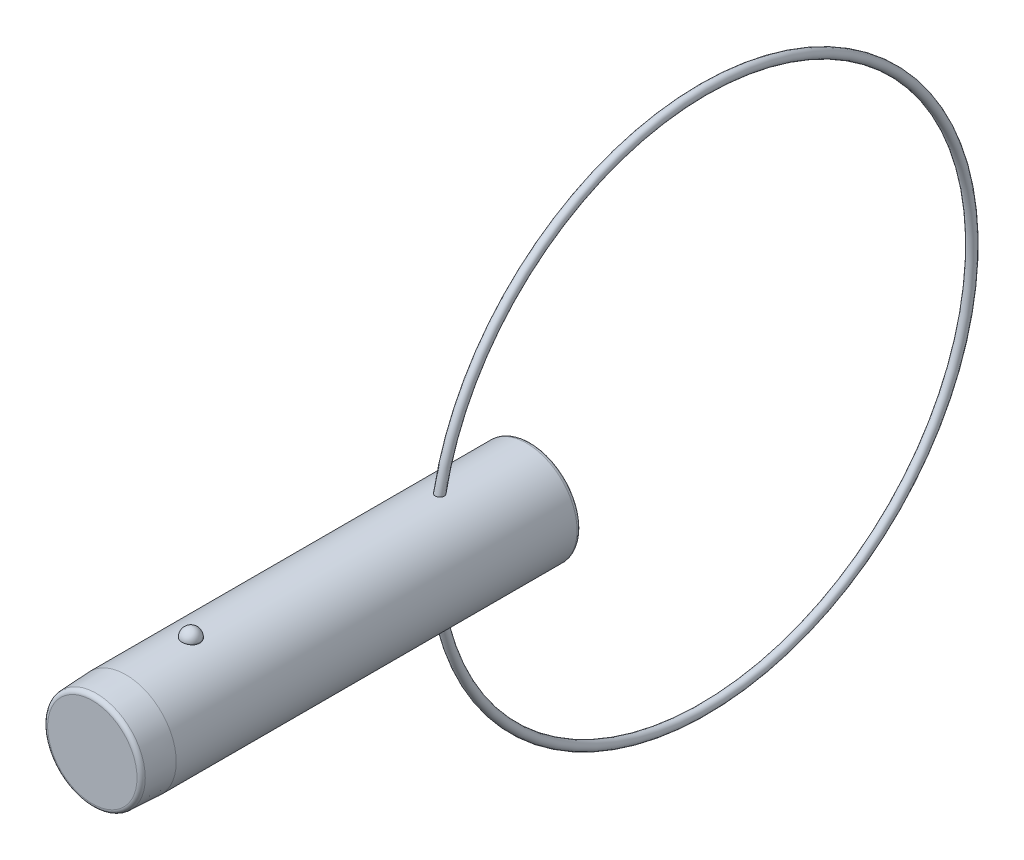
ISO-10303-21;
HEADER;
FILE_DESCRIPTION(('STEP AP214'),'2;1');
FILE_NAME('part.step','',(''),(''),'','','');
FILE_SCHEMA(('AUTOMOTIVE_DESIGN { 1 0 10303 214 1 1 1 1 }'));
ENDSEC;
DATA;
#1=APPLICATION_CONTEXT('core data for automotive mechanical design processes');
#2=APPLICATION_PROTOCOL_DEFINITION('international standard','automotive_design',2000,#1);
#3=PRODUCT_CONTEXT('',#1,'mechanical');
#4=PRODUCT('Part','Part','',(#3));
#5=PRODUCT_RELATED_PRODUCT_CATEGORY('part','',(#4));
#6=PRODUCT_DEFINITION_FORMATION('','',#4);
#7=PRODUCT_DEFINITION_CONTEXT('part definition',#1,'design');
#8=PRODUCT_DEFINITION('design','',#6,#7);
#9=PRODUCT_DEFINITION_SHAPE('','',#8);
#10=(LENGTH_UNIT() NAMED_UNIT(*) SI_UNIT(.MILLI.,.METRE.));
#11=(NAMED_UNIT(*) PLANE_ANGLE_UNIT() SI_UNIT($,.RADIAN.));
#12=(NAMED_UNIT(*) SI_UNIT($,.STERADIAN.) SOLID_ANGLE_UNIT());
#13=UNCERTAINTY_MEASURE_WITH_UNIT(LENGTH_MEASURE(1.E-05),#10,'distance_accuracy_value','');
#14=(GEOMETRIC_REPRESENTATION_CONTEXT(3) GLOBAL_UNCERTAINTY_ASSIGNED_CONTEXT((#13)) GLOBAL_UNIT_ASSIGNED_CONTEXT((#10,
#11,#12)) REPRESENTATION_CONTEXT('',''));
#15=CARTESIAN_POINT('',(0.,0.,0.));
#16=DIRECTION('',(0.,0.,1.));
#17=DIRECTION('',(1.,0.,0.));
#18=AXIS2_PLACEMENT_3D('',#15,#16,#17);
#19=CARTESIAN_POINT('',(0.,0.,-20.7518));
#20=DIRECTION('',(0.,0.,1.));
#21=DIRECTION('',(1.,0.,0.));
#22=AXIS2_PLACEMENT_3D('',#19,#20,#21);
#23=CYLINDRICAL_SURFACE('',#22,2.38125);
#24=CARTESIAN_POINT('',(-0.0992168207845669,-2.37918212522148,-16.6243451431655));
#25=CARTESIAN_POINT('',(-0.0892129535255001,-2.37959923147925,-16.6299028729145));
#26=CARTESIAN_POINT('',(-0.0787428802476738,-2.37997221236842,-16.6346374798677));
#27=CARTESIAN_POINT('',(-0.0571496681409544,-2.3805886228084,-16.6422972163222));
#28=CARTESIAN_POINT('',(-0.0460260694792663,-2.3808319598974,-16.6452210546261));
#29=CARTESIAN_POINT('',(-0.0234362098962118,-2.38116145060502,-16.6491525288583));
#30=CARTESIAN_POINT('',(-0.0119697971992463,-2.3812475335222,-16.6501593028835));
#31=CARTESIAN_POINT('',(0.0109657384867338,-2.38125236063726,-16.6502161409194));
#32=CARTESIAN_POINT('',(0.0224348605818359,-2.38117113579156,-16.6492665669069));
#33=CARTESIAN_POINT('',(0.0449259918066459,-2.38085246534648,-16.6454670769774));
#34=CARTESIAN_POINT('',(0.0559514384127191,-2.38061667459051,-16.642637287074));
#35=CARTESIAN_POINT('',(0.0773794754068056,-2.38001659394348,-16.6351964645713));
#36=CARTESIAN_POINT('',(0.0877820168550456,-2.3796522939713,-16.6305852922258));
#37=CARTESIAN_POINT('',(0.107832530487289,-2.37882868441724,-16.6196571030116));
#38=CARTESIAN_POINT('',(0.117467951209121,-2.37836812027513,-16.6133171856587));
#39=CARTESIAN_POINT('',(0.135580066351878,-2.37740447215415,-16.5991587344256));
#40=CARTESIAN_POINT('',(0.144056575167827,-2.37690138138529,-16.5913399641772));
#41=CARTESIAN_POINT('',(0.159908256351638,-2.37588850524756,-16.5741679606201));
#42=CARTESIAN_POINT('',(0.16723776564866,-2.37537904822922,-16.5647725507139));
#43=CARTESIAN_POINT('',(0.180267222960604,-2.3744258459735,-16.544909349794));
#44=CARTESIAN_POINT('',(0.185966910608594,-2.37398211124082,-16.5344413878004));
#45=CARTESIAN_POINT('',(0.195727601282848,-2.37319763830239,-16.5124172080602));
#46=CARTESIAN_POINT('',(0.199739336358036,-2.3728600611407,-16.5008390076106));
#47=CARTESIAN_POINT('',(0.205780419537465,-2.37234383097009,-16.477172485827));
#48=CARTESIAN_POINT('',(0.207809672094375,-2.37216518562105,-16.4650841399354));
#49=CARTESIAN_POINT('',(0.209822622632462,-2.37198800719989,-16.4406724071526));
#50=CARTESIAN_POINT('',(0.209795615259424,-2.37199041673963,-16.4283481241982));
#51=CARTESIAN_POINT('',(0.207651053512493,-2.3721791132192,-16.4038838330367));
#52=CARTESIAN_POINT('',(0.205533647626658,-2.37236538709852,-16.3917438118031));
#53=CARTESIAN_POINT('',(0.199292909685587,-2.37289769446054,-16.3681712476824));
#54=CARTESIAN_POINT('',(0.195197313427211,-2.373241515682,-16.3567313168984));
#55=CARTESIAN_POINT('',(0.185114263074713,-2.37404922273669,-16.3347224326483));
#56=CARTESIAN_POINT('',(0.179126988045131,-2.37451309720503,-16.3241533968633));
#57=CARTESIAN_POINT('',(0.165542382816301,-2.37549840750104,-16.304376210158));
#58=CARTESIAN_POINT('',(0.157974361168061,-2.37601872234128,-16.2951478643552));
#59=CARTESIAN_POINT('',(0.141380405143999,-2.37706374844031,-16.278111464573));
#60=CARTESIAN_POINT('',(0.132354555851283,-2.37758845944085,-16.2703033277625));
#61=CARTESIAN_POINT('',(0.113203754741449,-2.37857673736485,-16.256408621534));
#62=CARTESIAN_POINT('',(0.103091170227018,-2.37904088188744,-16.2503050403404));
#63=CARTESIAN_POINT('',(0.0819790884773928,-2.37986185397435,-16.2398866860315));
#64=CARTESIAN_POINT('',(0.0709796109680044,-2.38021868392466,-16.2355718731445));
#65=CARTESIAN_POINT('',(0.0484496325379454,-2.38078361686133,-16.2288654410948));
#66=CARTESIAN_POINT('',(0.0369212217605655,-2.38099225922994,-16.2264668431533));
#67=CARTESIAN_POINT('',(0.0136237625965134,-2.38123951322294,-16.2236334266555));
#68=CARTESIAN_POINT('',(0.00185471560839253,-2.38127812583526,-16.2231985966893));
#69=CARTESIAN_POINT('',(-0.0215809529792798,-2.38118102103449,-16.2243044213947));
#70=CARTESIAN_POINT('',(-0.033247642081559,-2.38104542882857,-16.2258436572338));
#71=CARTESIAN_POINT('',(-0.0561559759363871,-2.38061533639755,-16.2308523074714));
#72=CARTESIAN_POINT('',(-0.0673976223177698,-2.38032083678147,-16.2343217144724));
#73=CARTESIAN_POINT('',(-0.089137547811306,-2.37960594737431,-16.2430938833103));
#74=CARTESIAN_POINT('',(-0.0996357924592917,-2.3791855517514,-16.2483967300788));
#75=CARTESIAN_POINT('',(-0.119591422286004,-2.37826604320725,-16.2606862436462));
#76=CARTESIAN_POINT('',(-0.129048815460898,-2.37776693089081,-16.2676728975083));
#77=CARTESIAN_POINT('',(-0.1466670427362,-2.37674534861518,-16.2831397819066));
#78=CARTESIAN_POINT('',(-0.154826518807131,-2.37622285491443,-16.291621557508));
#79=CARTESIAN_POINT('',(-0.16961247456696,-2.37521330584176,-16.309831306273));
#80=CARTESIAN_POINT('',(-0.176238940378753,-2.37472625079067,-16.3195592907164));
#81=CARTESIAN_POINT('',(-0.187810176934647,-2.37383926863345,-16.3400316233924));
#82=CARTESIAN_POINT('',(-0.192747011080469,-2.37343975580697,-16.3507804732616));
#83=CARTESIAN_POINT('',(-0.200773490249188,-2.37277430017863,-16.3729504594629));
#84=CARTESIAN_POINT('',(-0.203863035445937,-2.37250836459531,-16.3843716320902));
#85=CARTESIAN_POINT('',(-0.208152932261162,-2.3721358891449,-16.4077039881559));
#86=CARTESIAN_POINT('',(-0.209330724278923,-2.37203125340709,-16.4196193450331));
#87=CARTESIAN_POINT('',(-0.20971350332811,-2.37199743385437,-16.443481437585));
#88=CARTESIAN_POINT('',(-0.208918355398989,-2.37206826204221,-16.4554281753506));
#89=CARTESIAN_POINT('',(-0.205360882526276,-2.37237890945928,-16.4792343810636));
#90=CARTESIAN_POINT('',(-0.202564758068257,-2.37262163149315,-16.4910887623278));
#91=CARTESIAN_POINT('',(-0.195051255834538,-2.37325107596703,-16.5141720236436));
#92=CARTESIAN_POINT('',(-0.190333257272529,-2.3736378449323,-16.5254007002524));
#93=CARTESIAN_POINT('',(-0.179032706024838,-2.37451706387463,-16.547050725614));
#94=CARTESIAN_POINT('',(-0.172427753228856,-2.37501076510587,-16.5574603338244));
#95=CARTESIAN_POINT('',(-0.157554354737845,-2.37604365046744,-16.5770008013189));
#96=CARTESIAN_POINT('',(-0.149287731540572,-2.37658278439479,-16.5861330431519));
#97=CARTESIAN_POINT('',(-0.134087107548748,-2.37747996622333,-16.6002622550436));
#98=CARTESIAN_POINT('',(-0.127527018353577,-2.37784263801898,-16.6056665066278));
#99=CARTESIAN_POINT('',(-0.113802394501804,-2.37853900820596,-16.6156465188407));
#100=CARTESIAN_POINT('',(-0.106637883291617,-2.37887270772015,-16.6202223115849));
#101=CARTESIAN_POINT('',(-0.0992168207845669,-2.37918212522148,-16.6243451431655));
#102=B_SPLINE_CURVE_WITH_KNOTS('',3,(#24,#25,#26,#27,#28,#29,#30,#31,#32,#33,#34,#35,#36,#37,
#38,#39,#40,#41,#42,#43,#44,#45,#46,#47,#48,#49,#50,#51,#52,#53,#54,#55,#56,#57,#58,#59,#60,#61,
#62,#63,#64,#65,#66,#67,#68,#69,#70,#71,#72,#73,#74,#75,#76,#77,#78,#79,#80,#81,#82,#83,#84,#85,
#86,#87,#88,#89,#90,#91,#92,#93,#94,#95,#96,#97,#98,#99,#100,#101),.UNSPECIFIED.,.T.,.F.,(4,2,2,
2,2,2,2,2,2,2,2,2,2,2,2,2,2,2,2,2,2,2,2,2,2,2,2,2,2,2,2,2,2,2,2,2,2,2,4),(0.,0.0343250766715696,
0.0686746012889136,0.103039565649918,0.137398172144777,0.17139480138197,0.205394098136333,
0.239867713077616,0.274346842672704,0.309965611031333,0.345590066377233,0.382192254745722,
0.41879620709897,0.455590740871369,0.492382661191945,0.528673078077549,0.564960060774995,
0.600626018856574,0.636289896119692,0.671583966766727,0.706877252638097,0.742041408194864,
0.777205359439467,0.812344051238375,0.847482608366373,0.88262279345582,0.917762708567805,
0.952939152610326,0.988115915064375,1.02345571341301,1.05879742132602,1.09455322373907,
1.13031147212403,1.16668843650118,1.20307716036398,1.23991721015437,1.27671707260454,
1.30218106668584,1.32764407343537),.UNSPECIFIED.);
#103=CARTESIAN_POINT('',(-0.0992168207845669,-2.37918212522148,-16.6243451431655));
#104=VERTEX_POINT('',#103);
#105=EDGE_CURVE('E11',#104,#104,#102,.T.);
#106=ORIENTED_EDGE('',*,*,#105,.F.);
#107=EDGE_LOOP('',(#106));
#108=FACE_BOUND('',#107,.T.);
#109=CARTESIAN_POINT('',(-0.0992168207845669,2.37918212522148,-16.6243451431655));
#110=CARTESIAN_POINT('',(-0.109694430984757,2.37874512622379,-16.618523046768));
#111=CARTESIAN_POINT('',(-0.119674894201061,2.37825913054484,-16.6117896362966));
#112=CARTESIAN_POINT('',(-0.138360753237763,2.37724545433318,-16.5967264319923));
#113=CARTESIAN_POINT('',(-0.147064136602109,2.37671770998363,-16.5883941653185));
#114=CARTESIAN_POINT('',(-0.162947958211019,2.37568155259744,-16.5704110015851));
#115=CARTESIAN_POINT('',(-0.170130976144569,2.37517310803684,-16.560762384562));
#116=CARTESIAN_POINT('',(-0.182811390257465,2.37423084782268,-16.5404165166081));
#117=CARTESIAN_POINT('',(-0.188309226696171,2.37379701269018,-16.52971954053));
#118=CARTESIAN_POINT('',(-0.19757318195525,2.3730441506002,-16.5073502707597));
#119=CARTESIAN_POINT('',(-0.201303437154942,2.37272752767761,-16.4956630245871));
#120=CARTESIAN_POINT('',(-0.206764167284371,2.37225793915619,-16.471825835366));
#121=CARTESIAN_POINT('',(-0.208494466075565,2.37210498797222,-16.4596758516609));
#122=CARTESIAN_POINT('',(-0.209895786759004,2.37198142003226,-16.4352130202392));
#123=CARTESIAN_POINT('',(-0.209559591958027,2.37201144226038,-16.422899751786));
#124=CARTESIAN_POINT('',(-0.206801060367367,2.37225352266552,-16.398510608048));
#125=CARTESIAN_POINT('',(-0.204378886126695,2.37246556665856,-16.3864347143408));
#126=CARTESIAN_POINT('',(-0.197549103554205,2.3730439051387,-16.3630510060089));
#127=CARTESIAN_POINT('',(-0.193170669114809,2.37340792809954,-16.3517346184802));
#128=CARTESIAN_POINT('',(-0.182547365161073,2.37424856842812,-16.3300191655496));
#129=CARTESIAN_POINT('',(-0.176302674530936,2.3747251750036,-16.3196200123529));
#130=CARTESIAN_POINT('',(-0.162239008364207,2.37572699288596,-16.3002173387613));
#131=CARTESIAN_POINT('',(-0.15444829034217,2.37625125141248,-16.2911932792251));
#132=CARTESIAN_POINT('',(-0.137447410269557,2.37729512472785,-16.2745990476242));
#133=CARTESIAN_POINT('',(-0.128237324457269,2.37781473976452,-16.2670287975202));
#134=CARTESIAN_POINT('',(-0.108757824126279,2.37878483994347,-16.2536292806747));
#135=CARTESIAN_POINT('',(-0.098499647305527,2.37923595131082,-16.2477837156537));
#136=CARTESIAN_POINT('',(-0.0771422272669015,2.38002409432032,-16.2379011452329));
#137=CARTESIAN_POINT('',(-0.0660430016403861,2.3803611283477,-16.2338641020184));
#138=CARTESIAN_POINT('',(-0.0433584058369282,2.38088215297587,-16.2277227725165));
#139=CARTESIAN_POINT('',(-0.0317747689033505,2.38106664713167,-16.2256121245177));
#140=CARTESIAN_POINT('',(-0.00841619129790585,2.3812637631528,-16.2233594241294));
#141=CARTESIAN_POINT('',(0.0033587484171444,2.38127638587749,-16.2232173618969));
#142=CARTESIAN_POINT('',(0.0267579632345982,2.381128388362,-16.2249052641801));
#143=CARTESIAN_POINT('',(0.0383823269710319,2.38096787520717,-16.2267340097415));
#144=CARTESIAN_POINT('',(0.061157837436692,2.38049177553864,-16.2323106633939));
#145=CARTESIAN_POINT('',(0.0723089862867172,2.38017618972001,-16.2360585628828));
#146=CARTESIAN_POINT('',(0.0938228081908354,2.37942531428058,-16.2453689970153));
#147=CARTESIAN_POINT('',(0.10418541548543,2.37899001469031,-16.2509316827967));
#148=CARTESIAN_POINT('',(0.123828292154108,2.37804855980062,-16.2637145899353));
#149=CARTESIAN_POINT('',(0.133108568590366,2.37754240496356,-16.2709348004762));
#150=CARTESIAN_POINT('',(0.150337650803446,2.37651528202549,-16.2868370954447));
#151=CARTESIAN_POINT('',(0.15828486140422,2.37599429703775,-16.295520906699));
#152=CARTESIAN_POINT('',(0.17261652540289,2.37499618099681,-16.3140960691509));
#153=CARTESIAN_POINT('',(0.179000963810178,2.37451905036431,-16.3239874319302));
#154=CARTESIAN_POINT('',(0.190067227067988,2.37365901313579,-16.3447484445979));
#155=CARTESIAN_POINT('',(0.194740280254872,2.37327659513588,-16.3556227878732));
#156=CARTESIAN_POINT('',(0.202223592065787,2.37265070459136,-16.3779978854588));
#157=CARTESIAN_POINT('',(0.205033744578792,2.37240723996165,-16.3894986754113));
#158=CARTESIAN_POINT('',(0.208755027345347,2.37208273307185,-16.4129501398155));
#159=CARTESIAN_POINT('',(0.209642424486972,2.3720037211614,-16.424904603642));
#160=CARTESIAN_POINT('',(0.209442304564252,2.37202138838777,-16.4487967709811));
#161=CARTESIAN_POINT('',(0.208354582242677,2.37211808578455,-16.4607344726228));
#162=CARTESIAN_POINT('',(0.204211200655354,2.37247839072844,-16.4844763466563));
#163=CARTESIAN_POINT('',(0.20112144493144,2.37274488879959,-16.4962745290284));
#164=CARTESIAN_POINT('',(0.193032540223011,2.37341660087396,-16.5191937607907));
#165=CARTESIAN_POINT('',(0.18803319727474,2.37382182896806,-16.530314741262));
#166=CARTESIAN_POINT('',(0.176192535798951,2.37473014683118,-16.5516851974494));
#167=CARTESIAN_POINT('',(0.169331702359515,2.37523425675777,-16.561923832324));
#168=CARTESIAN_POINT('',(0.153971896055263,2.37627929508187,-16.5810877562997));
#169=CARTESIAN_POINT('',(0.145472956762337,2.37682022272468,-16.5900130723098));
#170=CARTESIAN_POINT('',(0.127157355163896,2.37786998544574,-16.6061832006009));
#171=CARTESIAN_POINT('',(0.117355236614629,2.3783790946651,-16.6134444448813));
#172=CARTESIAN_POINT('',(0.096636175311749,2.37931088324006,-16.6261563542005));
#173=CARTESIAN_POINT('',(0.0857195027384118,2.37973358346793,-16.6316074566817));
#174=CARTESIAN_POINT('',(0.0634498609688475,2.38042974185345,-16.640358629596));
#175=CARTESIAN_POINT('',(0.0521216410074709,2.38070750063429,-16.6437213276633));
#176=CARTESIAN_POINT('',(0.0290489054428623,2.38110072653972,-16.6484372361214));
#177=CARTESIAN_POINT('',(0.0173043743484591,2.38121618761862,-16.6497903716548));
#178=CARTESIAN_POINT('',(-0.00588850926483803,2.38127014214721,-16.650425391871));
#179=CARTESIAN_POINT('',(-0.0173352731405945,2.38121380043678,-16.6497677249102));
#180=CARTESIAN_POINT('',(-0.0399428435041347,2.38094174804946,-16.6465360901527));
#181=CARTESIAN_POINT('',(-0.0511039857372656,2.38072623430818,-16.6439644903393));
#182=CARTESIAN_POINT('',(-0.0684210880141177,2.38027565079308,-16.63841782741));
#183=CARTESIAN_POINT('',(-0.074772269583273,2.38008390715386,-16.636028694707));
#184=CARTESIAN_POINT('',(-0.0872075633157318,2.3796607061389,-16.6306385529639));
#185=CARTESIAN_POINT('',(-0.0932916847041405,2.37942925013631,-16.6276375650794));
#186=CARTESIAN_POINT('',(-0.0992168207845669,2.37918212522148,-16.6243451431655));
#187=B_SPLINE_CURVE_WITH_KNOTS('',3,(#109,#110,#111,#112,#113,#114,#115,#116,#117,#118,#119,
#120,#121,#122,#123,#124,#125,#126,#127,#128,#129,#130,#131,#132,#133,#134,#135,#136,#137,#138,
#139,#140,#141,#142,#143,#144,#145,#146,#147,#148,#149,#150,#151,#152,#153,#154,#155,#156,#157,
#158,#159,#160,#161,#162,#163,#164,#165,#166,#167,#168,#169,#170,#171,#172,#173,#174,#175,#176,
#177,#178,#179,#180,#181,#182,#183,#184,#185,#186),.UNSPECIFIED.,.T.,.F.,(4,2,2,2,2,2,2,2,2,2,2,
2,2,2,2,2,2,2,2,2,2,2,2,2,2,2,2,2,2,2,2,2,2,2,2,2,2,2,4),(0.,0.0359578305409478,
0.0719717294883693,0.107924022903758,0.143866915639622,0.180510779274994,0.217157869933214,
0.253933013597156,0.290705291833844,0.32694659326008,0.363184422002252,0.398812500129346,
0.434438665237395,0.469716506097716,0.504993609291085,0.54015378765058,0.575313790207661,
0.610452058605245,0.645590169507645,0.68073120750751,0.715872016200418,0.751054579735456,
0.786237480739634,0.8215982673519,0.856961067945405,0.892757932401057,0.928558517130784,
0.964985439137226,1.00141606214363,1.03824443801044,1.07507205918439,1.11151864034012,
1.14795640732307,1.1832407583392,1.21852642368697,1.2527618751522,1.28695503960862,
1.30729005882514,1.32762437505196),.UNSPECIFIED.);
#188=CARTESIAN_POINT('',(-0.0992168207845669,2.37918212522148,-16.6243451431655));
#189=VERTEX_POINT('',#188);
#190=EDGE_CURVE('E53',#189,#189,#187,.T.);
#191=ORIENTED_EDGE('',*,*,#190,.F.);
#192=EDGE_LOOP('',(#191));
#193=FACE_BOUND('',#192,.T.);
#194=CARTESIAN_POINT('',(0.,0.,-20.5518));
#195=DIRECTION('',(0.,0.,1.));
#196=DIRECTION('',(1.,0.,0.));
#197=AXIS2_PLACEMENT_3D('',#194,#195,#196);
#198=CIRCLE('',#197,2.38125);
#199=CARTESIAN_POINT('',(2.38125,0.,-20.5518));
#200=VERTEX_POINT('',#199);
#201=EDGE_CURVE('E198',#200,#200,#198,.T.);
#202=ORIENTED_EDGE('',*,*,#201,.T.);
#203=EDGE_LOOP('',(#202));
#204=FACE_BOUND('',#203,.T.);
#205=CARTESIAN_POINT('',(0.,0.,-1.5875));
#206=DIRECTION('',(0.,0.,1.));
#207=DIRECTION('',(1.,0.,0.));
#208=AXIS2_PLACEMENT_3D('',#205,#206,#207);
#209=CIRCLE('',#208,2.38125);
#210=CARTESIAN_POINT('',(2.38125,0.,-1.5875));
#211=VERTEX_POINT('',#210);
#212=EDGE_CURVE('E70',#211,#211,#209,.T.);
#213=ORIENTED_EDGE('',*,*,#212,.F.);
#214=EDGE_LOOP('',(#213));
#215=FACE_BOUND('',#214,.T.);
#216=CARTESIAN_POINT('',(0.,2.38125,-4.2418));
#217=CARTESIAN_POINT('',(0.0233477447442924,2.38124958829977,-4.24180091804614));
#218=CARTESIAN_POINT('',(0.0467077410097407,2.38090305587247,-4.24375761989309));
#219=CARTESIAN_POINT('',(0.0927712134802722,2.37955405176342,-4.25152870049687));
#220=CARTESIAN_POINT('',(0.115474088852243,2.37855099842266,-4.25734650014125));
#221=CARTESIAN_POINT('',(0.159550327007424,2.37600132758596,-4.27265755941516));
#222=CARTESIAN_POINT('',(0.180924808629257,2.37445517502215,-4.28214767598042));
#223=CARTESIAN_POINT('',(0.221775709707632,2.37098880235525,-4.30452544210873));
#224=CARTESIAN_POINT('',(0.241252318254594,2.36906861957514,-4.31741275272477));
#225=CARTESIAN_POINT('',(0.277963669920021,2.3650438683166,-4.34636441649695));
#226=CARTESIAN_POINT('',(0.295175355408274,2.36293772134908,-4.3624577908851));
#227=CARTESIAN_POINT('',(0.326668979278105,2.35879033878669,-4.39730229645336));
#228=CARTESIAN_POINT('',(0.340950722000182,2.35674910753453,-4.41605360498712));
#229=CARTESIAN_POINT('',(0.366272989827006,2.35294736756161,-4.45584208663309));
#230=CARTESIAN_POINT('',(0.377290428037032,2.35118889683113,-4.47689416453657));
#231=CARTESIAN_POINT('',(0.395623638927046,2.34817383611601,-4.52058641713378));
#232=CARTESIAN_POINT('',(0.402939691399484,2.34691720819795,-4.54322647164298));
#233=CARTESIAN_POINT('',(0.413589212983458,2.34506390805662,-4.58920656357916));
#234=CARTESIAN_POINT('',(0.416962669735694,2.34446061410018,-4.61253706735574));
#235=CARTESIAN_POINT('',(0.419755282117743,2.34396228925048,-4.6594401561294));
#236=CARTESIAN_POINT('',(0.419174749859425,2.34406720245421,-4.68301272187243));
#237=CARTESIAN_POINT('',(0.414108370790399,2.34496739944046,-4.72944350964509));
#238=CARTESIAN_POINT('',(0.409667681459888,2.34575470010506,-4.75230683656259));
#239=CARTESIAN_POINT('',(0.397078018580647,2.34791844854694,-4.7969587992398));
#240=CARTESIAN_POINT('',(0.388928904570119,2.34929491863973,-4.81874739425788));
#241=CARTESIAN_POINT('',(0.369108639369491,2.35249041560559,-4.86076525248096));
#242=CARTESIAN_POINT('',(0.357418961838509,2.35431176038249,-4.88098559307666));
#243=CARTESIAN_POINT('',(0.330862527449868,2.35819021221528,-4.91919483244397));
#244=CARTESIAN_POINT('',(0.315995485412577,2.36024734042587,-4.93718353068865));
#245=CARTESIAN_POINT('',(0.283261417048179,2.36440052463933,-4.97068003835678));
#246=CARTESIAN_POINT('',(0.265355697337166,2.36649672522049,-4.98615004208792));
#247=CARTESIAN_POINT('',(0.227182809484419,2.37046559988552,-5.0138719417036));
#248=CARTESIAN_POINT('',(0.206915622698674,2.37233827220437,-5.02612381217818));
#249=CARTESIAN_POINT('',(0.164557879309152,2.37565221711297,-5.04706601855463));
#250=CARTESIAN_POINT('',(0.142465508353663,2.37709305368444,-5.05575275804128));
#251=CARTESIAN_POINT('',(0.0971042794374512,2.37937754613665,-5.06928167647985));
#252=CARTESIAN_POINT('',(0.0738355316009141,2.38022125780555,-5.0741242145928));
#253=CARTESIAN_POINT('',(0.0271076532790078,2.38120886546867,-5.07977542380291));
#254=CARTESIAN_POINT('',(0.00365497781873325,2.38136175700159,-5.08063595039223));
#255=CARTESIAN_POINT('',(-0.0430592962750156,2.38097522705261,-5.07843732619705));
#256=CARTESIAN_POINT('',(-0.0663209030957246,2.38043583539222,-5.07537834425346));
#257=CARTESIAN_POINT('',(-0.111830686120967,2.37873092782373,-5.06547066245408));
#258=CARTESIAN_POINT('',(-0.13408467935649,2.37756969570114,-5.05864788138025));
#259=CARTESIAN_POINT('',(-0.177132959503043,2.37475077238766,-5.04143408633682));
#260=CARTESIAN_POINT('',(-0.197927156691564,2.37309305071426,-5.0310428532726));
#261=CARTESIAN_POINT('',(-0.237689114621588,2.36944263829179,-5.00687009548898));
#262=CARTESIAN_POINT('',(-0.256637077920213,2.36744683742702,-4.99305648476404));
#263=CARTESIAN_POINT('',(-0.291964559834401,2.36335039912227,-4.96247491185972));
#264=CARTESIAN_POINT('',(-0.308343868738704,2.36124975314091,-4.94570670869724));
#265=CARTESIAN_POINT('',(-0.338263416561134,2.35715096244085,-4.90945839193518));
#266=CARTESIAN_POINT('',(-0.35176846263945,2.35515429201361,-4.88994903637107));
#267=CARTESIAN_POINT('',(-0.375309627809292,2.35151796138301,-4.84890814243525));
#268=CARTESIAN_POINT('',(-0.385345865635828,2.34987828896054,-4.82737667331124));
#269=CARTESIAN_POINT('',(-0.401613067410578,2.3471528887971,-4.78299721581754));
#270=CARTESIAN_POINT('',(-0.40786094526309,2.34606470246552,-4.76015558511589));
#271=CARTESIAN_POINT('',(-0.416426866515635,2.34455954754681,-4.71372611456064));
#272=CARTESIAN_POINT('',(-0.418745295148451,2.34414251316192,-4.69013834808722));
#273=CARTESIAN_POINT('',(-0.419374823659369,2.34402993659359,-4.64323805328274));
#274=CARTESIAN_POINT('',(-0.417741365883088,2.3443244123196,-4.61992627477142));
#275=CARTESIAN_POINT('',(-0.410634023947854,2.34557968741451,-4.57391492903725));
#276=CARTESIAN_POINT('',(-0.405160156549621,2.34654048387538,-4.55121535914299));
#277=CARTESIAN_POINT('',(-0.390549567686535,2.34901616961977,-4.50709787520807));
#278=CARTESIAN_POINT('',(-0.381418155983931,2.35053025539912,-4.48567815475108));
#279=CARTESIAN_POINT('',(-0.359757528573428,2.35394260085702,-4.44466578815967));
#280=CARTESIAN_POINT('',(-0.347228112871356,2.3558408831463,-4.42507324965779));
#281=CARTESIAN_POINT('',(-0.318931483969949,2.35983909557778,-4.38799231546967));
#282=CARTESIAN_POINT('',(-0.303123667564615,2.36194135918562,-4.37053515102734));
#283=CARTESIAN_POINT('',(-0.268804220532814,2.366092559954,-4.33850247184203));
#284=CARTESIAN_POINT('',(-0.250291968473156,2.36814148473034,-4.32392762122221));
#285=CARTESIAN_POINT('',(-0.210916930797051,2.37197376905804,-4.29796836637877));
#286=CARTESIAN_POINT('',(-0.190036946469099,2.37375493386654,-4.28660971917903));
#287=CARTESIAN_POINT('',(-0.146641521701595,2.37682964730899,-4.26757914833852));
#288=CARTESIAN_POINT('',(-0.124127694747586,2.37812366940594,-4.25990364298035));
#289=CARTESIAN_POINT('',(-0.0846127470114201,2.37980391314781,-4.25007686067267));
#290=CARTESIAN_POINT('',(-0.0678473524531861,2.38034322671996,-4.24697815154446));
#291=CARTESIAN_POINT('',(-0.0340568082005323,2.38106641665774,-4.24283940750978));
#292=CARTESIAN_POINT('',(-0.0170316638503059,2.38125030032622,-4.24179933030563));
#293=CARTESIAN_POINT('',(0.,2.38125,-4.2418));
#294=B_SPLINE_CURVE_WITH_KNOTS('',3,(#216,#217,#218,#219,#220,#221,#222,#223,#224,#225,#226,
#227,#228,#229,#230,#231,#232,#233,#234,#235,#236,#237,#238,#239,#240,#241,#242,#243,#244,#245,
#246,#247,#248,#249,#250,#251,#252,#253,#254,#255,#256,#257,#258,#259,#260,#261,#262,#263,#264,
#265,#266,#267,#268,#269,#270,#271,#272,#273,#274,#275,#276,#277,#278,#279,#280,#281,#282,#283,
#284,#285,#286,#287,#288,#289,#290,#291,#292,#293),.UNSPECIFIED.,.T.,.F.,(4,2,2,2,2,2,2,2,2,2,2,
2,2,2,2,2,2,2,2,2,2,2,2,2,2,2,2,2,2,2,2,2,2,2,2,2,2,2,4),(0.,0.0699809656850683,
0.14002401660845,0.210007251176537,0.279983505974064,0.350624592651235,0.421270395155637,
0.492404527696077,0.56353328231339,0.633934177119583,0.704329514828856,0.773912259687379,
0.843497640309574,0.913453615063761,0.983415871251393,1.05434698128019,1.12527865135485,
1.19628170068615,1.26727811547143,1.33734733253009,1.4074135313143,1.47700314730919,
1.54659703670815,1.61686986996423,1.68714843748369,1.75824345075078,1.82933603024157,
1.90010881931923,1.97087466961885,2.04065349279347,2.11043201143388,2.1801095956267,
2.24979128167934,2.32039390235829,2.39101277190768,2.4621821547383,2.5332821870442,
2.58433280398815,2.63538237200945),.UNSPECIFIED.);
#295=CARTESIAN_POINT('',(0.,2.38125,-4.2418));
#296=VERTEX_POINT('',#295);
#297=CARTESIAN_POINT('',(0.,2.38125,-5.08));
#298=VERTEX_POINT('',#297);
#299=EDGE_CURVE('E64',#296,#298,#294,.T.);
#300=ORIENTED_EDGE('',*,*,#299,.F.);
#301=CARTESIAN_POINT('',(0.,2.38125,-4.2418));
#302=CARTESIAN_POINT('',(0.0233477447442924,2.38124958829977,-4.24180091804614));
#303=CARTESIAN_POINT('',(0.0467077410097407,2.38090305587247,-4.24375761989309));
#304=CARTESIAN_POINT('',(0.0927712134802722,2.37955405176342,-4.25152870049687));
#305=CARTESIAN_POINT('',(0.115474088852243,2.37855099842266,-4.25734650014125));
#306=CARTESIAN_POINT('',(0.159550327007424,2.37600132758596,-4.27265755941516));
#307=CARTESIAN_POINT('',(0.180924808629257,2.37445517502215,-4.28214767598042));
#308=CARTESIAN_POINT('',(0.221775709707632,2.37098880235525,-4.30452544210873));
#309=CARTESIAN_POINT('',(0.241252318254594,2.36906861957514,-4.31741275272477));
#310=CARTESIAN_POINT('',(0.277963669920021,2.3650438683166,-4.34636441649695));
#311=CARTESIAN_POINT('',(0.295175355408274,2.36293772134908,-4.3624577908851));
#312=CARTESIAN_POINT('',(0.326668979278105,2.35879033878669,-4.39730229645336));
#313=CARTESIAN_POINT('',(0.340950722000182,2.35674910753453,-4.41605360498712));
#314=CARTESIAN_POINT('',(0.366272989827006,2.35294736756161,-4.45584208663309));
#315=CARTESIAN_POINT('',(0.377290428037032,2.35118889683113,-4.47689416453657));
#316=CARTESIAN_POINT('',(0.395623638927046,2.34817383611601,-4.52058641713378));
#317=CARTESIAN_POINT('',(0.402939691399484,2.34691720819795,-4.54322647164298));
#318=CARTESIAN_POINT('',(0.413589212983458,2.34506390805662,-4.58920656357916));
#319=CARTESIAN_POINT('',(0.416962669735694,2.34446061410018,-4.61253706735574));
#320=CARTESIAN_POINT('',(0.419755282117743,2.34396228925048,-4.6594401561294));
#321=CARTESIAN_POINT('',(0.419174749859425,2.34406720245421,-4.68301272187243));
#322=CARTESIAN_POINT('',(0.414108370790399,2.34496739944046,-4.72944350964509));
#323=CARTESIAN_POINT('',(0.409667681459888,2.34575470010506,-4.75230683656259));
#324=CARTESIAN_POINT('',(0.397078018580647,2.34791844854694,-4.7969587992398));
#325=CARTESIAN_POINT('',(0.388928904570119,2.34929491863973,-4.81874739425788));
#326=CARTESIAN_POINT('',(0.369108639369491,2.35249041560559,-4.86076525248096));
#327=CARTESIAN_POINT('',(0.357418961838509,2.35431176038249,-4.88098559307666));
#328=CARTESIAN_POINT('',(0.330862527449868,2.35819021221528,-4.91919483244397));
#329=CARTESIAN_POINT('',(0.315995485412577,2.36024734042587,-4.93718353068865));
#330=CARTESIAN_POINT('',(0.283261417048179,2.36440052463933,-4.97068003835678));
#331=CARTESIAN_POINT('',(0.265355697337166,2.36649672522049,-4.98615004208792));
#332=CARTESIAN_POINT('',(0.227182809484419,2.37046559988552,-5.0138719417036));
#333=CARTESIAN_POINT('',(0.206915622698674,2.37233827220437,-5.02612381217818));
#334=CARTESIAN_POINT('',(0.164557879309152,2.37565221711297,-5.04706601855463));
#335=CARTESIAN_POINT('',(0.142465508353663,2.37709305368444,-5.05575275804128));
#336=CARTESIAN_POINT('',(0.0971042794374512,2.37937754613665,-5.06928167647985));
#337=CARTESIAN_POINT('',(0.0738355316009141,2.38022125780555,-5.0741242145928));
#338=CARTESIAN_POINT('',(0.0271076532790078,2.38120886546867,-5.07977542380291));
#339=CARTESIAN_POINT('',(0.00365497781873325,2.38136175700159,-5.08063595039223));
#340=CARTESIAN_POINT('',(-0.0430592962750156,2.38097522705261,-5.07843732619705));
#341=CARTESIAN_POINT('',(-0.0663209030957246,2.38043583539222,-5.07537834425346));
#342=CARTESIAN_POINT('',(-0.111830686120967,2.37873092782373,-5.06547066245408));
#343=CARTESIAN_POINT('',(-0.13408467935649,2.37756969570114,-5.05864788138025));
#344=CARTESIAN_POINT('',(-0.177132959503043,2.37475077238766,-5.04143408633682));
#345=CARTESIAN_POINT('',(-0.197927156691564,2.37309305071426,-5.0310428532726));
#346=CARTESIAN_POINT('',(-0.237689114621588,2.36944263829179,-5.00687009548898));
#347=CARTESIAN_POINT('',(-0.256637077920213,2.36744683742702,-4.99305648476404));
#348=CARTESIAN_POINT('',(-0.291964559834401,2.36335039912227,-4.96247491185972));
#349=CARTESIAN_POINT('',(-0.308343868738704,2.36124975314091,-4.94570670869724));
#350=CARTESIAN_POINT('',(-0.338263416561134,2.35715096244085,-4.90945839193518));
#351=CARTESIAN_POINT('',(-0.35176846263945,2.35515429201361,-4.88994903637107));
#352=CARTESIAN_POINT('',(-0.375309627809292,2.35151796138301,-4.84890814243525));
#353=CARTESIAN_POINT('',(-0.385345865635828,2.34987828896054,-4.82737667331124));
#354=CARTESIAN_POINT('',(-0.401613067410578,2.3471528887971,-4.78299721581754));
#355=CARTESIAN_POINT('',(-0.40786094526309,2.34606470246552,-4.76015558511589));
#356=CARTESIAN_POINT('',(-0.416426866515635,2.34455954754681,-4.71372611456064));
#357=CARTESIAN_POINT('',(-0.418745295148451,2.34414251316192,-4.69013834808722));
#358=CARTESIAN_POINT('',(-0.419374823659369,2.34402993659359,-4.64323805328274));
#359=CARTESIAN_POINT('',(-0.417741365883088,2.3443244123196,-4.61992627477142));
#360=CARTESIAN_POINT('',(-0.410634023947854,2.34557968741451,-4.57391492903725));
#361=CARTESIAN_POINT('',(-0.405160156549621,2.34654048387538,-4.55121535914299));
#362=CARTESIAN_POINT('',(-0.390549567686535,2.34901616961977,-4.50709787520807));
#363=CARTESIAN_POINT('',(-0.381418155983931,2.35053025539912,-4.48567815475108));
#364=CARTESIAN_POINT('',(-0.359757528573428,2.35394260085702,-4.44466578815967));
#365=CARTESIAN_POINT('',(-0.347228112871356,2.3558408831463,-4.42507324965779));
#366=CARTESIAN_POINT('',(-0.318931483969949,2.35983909557778,-4.38799231546967));
#367=CARTESIAN_POINT('',(-0.303123667564615,2.36194135918562,-4.37053515102734));
#368=CARTESIAN_POINT('',(-0.268804220532814,2.366092559954,-4.33850247184203));
#369=CARTESIAN_POINT('',(-0.250291968473156,2.36814148473034,-4.32392762122221));
#370=CARTESIAN_POINT('',(-0.210916930797051,2.37197376905804,-4.29796836637877));
#371=CARTESIAN_POINT('',(-0.190036946469099,2.37375493386654,-4.28660971917903));
#372=CARTESIAN_POINT('',(-0.146641521701595,2.37682964730899,-4.26757914833852));
#373=CARTESIAN_POINT('',(-0.124127694747586,2.37812366940594,-4.25990364298035));
#374=CARTESIAN_POINT('',(-0.0846127470114201,2.37980391314781,-4.25007686067267));
#375=CARTESIAN_POINT('',(-0.0678473524531861,2.38034322671996,-4.24697815154446));
#376=CARTESIAN_POINT('',(-0.0340568082005323,2.38106641665774,-4.24283940750978));
#377=CARTESIAN_POINT('',(-0.0170316638503059,2.38125030032622,-4.24179933030563));
#378=CARTESIAN_POINT('',(0.,2.38125,-4.2418));
#379=B_SPLINE_CURVE_WITH_KNOTS('',3,(#301,#302,#303,#304,#305,#306,#307,#308,#309,#310,#311,
#312,#313,#314,#315,#316,#317,#318,#319,#320,#321,#322,#323,#324,#325,#326,#327,#328,#329,#330,
#331,#332,#333,#334,#335,#336,#337,#338,#339,#340,#341,#342,#343,#344,#345,#346,#347,#348,#349,
#350,#351,#352,#353,#354,#355,#356,#357,#358,#359,#360,#361,#362,#363,#364,#365,#366,#367,#368,
#369,#370,#371,#372,#373,#374,#375,#376,#377,#378),.UNSPECIFIED.,.T.,.F.,(4,2,2,2,2,2,2,2,2,2,2,
2,2,2,2,2,2,2,2,2,2,2,2,2,2,2,2,2,2,2,2,2,2,2,2,2,2,2,4),(0.,0.0699809656850683,
0.14002401660845,0.210007251176537,0.279983505974064,0.350624592651235,0.421270395155637,
0.492404527696077,0.56353328231339,0.633934177119583,0.704329514828856,0.773912259687379,
0.843497640309574,0.913453615063761,0.983415871251393,1.05434698128019,1.12527865135485,
1.19628170068615,1.26727811547143,1.33734733253009,1.4074135313143,1.47700314730919,
1.54659703670815,1.61686986996423,1.68714843748369,1.75824345075078,1.82933603024157,
1.90010881931923,1.97087466961885,2.04065349279347,2.11043201143388,2.1801095956267,
2.24979128167934,2.32039390235829,2.39101277190768,2.4621821547383,2.5332821870442,
2.58433280398815,2.63538237200945),.UNSPECIFIED.);
#380=EDGE_CURVE('E74',#298,#296,#379,.T.);
#381=ORIENTED_EDGE('',*,*,#380,.F.);
#382=EDGE_LOOP('',(#300,#381));
#383=FACE_BOUND('',#382,.T.);
#384=ADVANCED_FACE('F40',(#108,#193,#204,#215,#383),#23,.T.);
#385=CARTESIAN_POINT('',(0.,0.,-20.7518));
#386=DIRECTION('',(0.,0.,1.));
#387=DIRECTION('',(1.,0.,0.));
#388=AXIS2_PLACEMENT_3D('',#385,#386,#387);
#389=PLANE('',#388);
#390=CARTESIAN_POINT('',(0.,0.,-20.7518));
#391=DIRECTION('',(0.,0.,1.));
#392=DIRECTION('',(1.,0.,0.));
#393=AXIS2_PLACEMENT_3D('',#390,#391,#392);
#394=CIRCLE('',#393,2.18125);
#395=CARTESIAN_POINT('',(2.18125,0.,-20.7518));
#396=VERTEX_POINT('',#395);
#397=EDGE_CURVE('E195',#396,#396,#394,.F.);
#398=ORIENTED_EDGE('',*,*,#397,.T.);
#399=EDGE_LOOP('',(#398));
#400=FACE_BOUND('',#399,.T.);
#401=ADVANCED_FACE('F99',(#400),#389,.F.);
#402=CARTESIAN_POINT('',(0.,0.,0.));
#403=DIRECTION('',(0.,0.,-1.));
#404=DIRECTION('',(-1.,0.,0.));
#405=AXIS2_PLACEMENT_3D('',#402,#403,#404);
#406=CONICAL_SURFACE('',#405,2.30505,0.0479631868770763);
#407=CARTESIAN_POINT('',(0.,0.,-0.19041104012632));
#408=DIRECTION('',(0.,0.,1.));
#409=DIRECTION('',(1.,0.,0.));
#410=AXIS2_PLACEMENT_3D('',#407,#408,#409);
#411=CIRCLE('',#410,2.31418972992606);
#412=CARTESIAN_POINT('',(2.31418972992606,0.,-0.19041104012632));
#413=VERTEX_POINT('',#412);
#414=EDGE_CURVE('E116',#413,#413,#411,.F.);
#415=ORIENTED_EDGE('',*,*,#414,.T.);
#416=EDGE_LOOP('',(#415));
#417=FACE_BOUND('',#416,.T.);
#418=ORIENTED_EDGE('',*,*,#212,.T.);
#419=EDGE_LOOP('',(#418));
#420=FACE_BOUND('',#419,.T.);
#421=ADVANCED_FACE('F95',(#417,#420),#406,.T.);
#422=CARTESIAN_POINT('',(0.,0.,0.));
#423=DIRECTION('',(0.,0.,1.));
#424=DIRECTION('',(1.,0.,0.));
#425=AXIS2_PLACEMENT_3D('',#422,#423,#424);
#426=PLANE('',#425);
#427=CARTESIAN_POINT('',(0.,0.,0.));
#428=DIRECTION('',(0.,0.,1.));
#429=DIRECTION('',(1.,0.,0.));
#430=AXIS2_PLACEMENT_3D('',#427,#428,#429);
#431=CIRCLE('',#430,2.11441973255774);
#432=CARTESIAN_POINT('',(2.11441973255774,0.,0.));
#433=VERTEX_POINT('',#432);
#434=EDGE_CURVE('E200',#433,#433,#431,.T.);
#435=ORIENTED_EDGE('',*,*,#434,.T.);
#436=EDGE_LOOP('',(#435));
#437=FACE_BOUND('',#436,.T.);
#438=ADVANCED_FACE('F98',(#437),#426,.T.);
#439=CARTESIAN_POINT('',(0.,-2.38325,-4.6609));
#440=DIRECTION('',(0.,1.,0.));
#441=DIRECTION('',(0.,0.,1.));
#442=AXIS2_PLACEMENT_3D('',#439,#440,#441);
#443=CYLINDRICAL_SURFACE('',#442,0.4191);
#444=CARTESIAN_POINT('',(0.,2.38125,-4.6609));
#445=DIRECTION('',(0.,-1.,0.));
#446=DIRECTION('',(0.,0.,-1.));
#447=AXIS2_PLACEMENT_3D('',#444,#445,#446);
#448=CIRCLE('',#447,0.4191);
#449=EDGE_CURVE('E66',#298,#296,#448,.T.);
#450=ORIENTED_EDGE('',*,*,#449,.T.);
#451=ORIENTED_EDGE('',*,*,#299,.T.);
#452=EDGE_LOOP('',(#450,#451));
#453=FACE_BOUND('',#452,.T.);
#454=ADVANCED_FACE('F65',(#453),#443,.T.);
#455=CARTESIAN_POINT('',(0.,2.38125,-4.6609));
#456=DIRECTION('',(0.,-1.,0.));
#457=DIRECTION('',(0.,0.,-1.));
#458=AXIS2_PLACEMENT_3D('',#455,#456,#457);
#459=SPHERICAL_SURFACE('',#458,0.419100000000001);
#460=ORIENTED_EDGE('',*,*,#449,.F.);
#461=CARTESIAN_POINT('',(0.,2.38125,-4.6609));
#462=DIRECTION('',(0.,-1.,0.));
#463=DIRECTION('',(0.,0.,-1.));
#464=AXIS2_PLACEMENT_3D('',#461,#462,#463);
#465=CIRCLE('',#464,0.4191);
#466=EDGE_CURVE('E59',#296,#298,#465,.T.);
#467=ORIENTED_EDGE('',*,*,#466,.F.);
#468=EDGE_LOOP('',(#460,#467));
#469=FACE_BOUND('',#468,.T.);
#470=ADVANCED_FACE('F72',(#469),#459,.T.);
#471=CARTESIAN_POINT('',(0.,-2.38325,-4.6609));
#472=DIRECTION('',(0.,1.,0.));
#473=DIRECTION('',(0.,0.,1.));
#474=AXIS2_PLACEMENT_3D('',#471,#472,#473);
#475=CYLINDRICAL_SURFACE('',#474,0.4191);
#476=ORIENTED_EDGE('',*,*,#466,.T.);
#477=ORIENTED_EDGE('',*,*,#380,.T.);
#478=EDGE_LOOP('',(#476,#477));
#479=FACE_BOUND('',#478,.T.);
#480=ADVANCED_FACE('F77',(#479),#475,.T.);
#481=CARTESIAN_POINT('',(0.,0.,-20.5518));
#482=DIRECTION('',(0.,0.,1.));
#483=DIRECTION('',(1.,0.,0.));
#484=AXIS2_PLACEMENT_3D('',#481,#482,#483);
#485=TOROIDAL_SURFACE('',#484,2.18125,0.2);
#486=ORIENTED_EDGE('',*,*,#397,.F.);
#487=EDGE_LOOP('',(#486));
#488=FACE_BOUND('',#487,.T.);
#489=ORIENTED_EDGE('',*,*,#201,.F.);
#490=EDGE_LOOP('',(#489));
#491=FACE_BOUND('',#490,.T.);
#492=ADVANCED_FACE('F109',(#488,#491),#485,.T.);
#493=CARTESIAN_POINT('',(0.,0.,-0.2));
#494=DIRECTION('',(0.,0.,1.));
#495=DIRECTION('',(1.,0.,0.));
#496=AXIS2_PLACEMENT_3D('',#493,#494,#495);
#497=TOROIDAL_SURFACE('',#496,2.11441973255774,0.2);
#498=ORIENTED_EDGE('',*,*,#414,.F.);
#499=EDGE_LOOP('',(#498));
#500=FACE_BOUND('',#499,.T.);
#501=ORIENTED_EDGE('',*,*,#434,.F.);
#502=EDGE_LOOP('',(#501));
#503=FACE_BOUND('',#502,.T.);
#504=ADVANCED_FACE('F42',(#500,#503),#497,.T.);
#505=CARTESIAN_POINT('',(0.,0.,-28.91155));
#506=DIRECTION('',(-1.,0.,0.));
#507=DIRECTION('',(0.,0.,1.));
#508=AXIS2_PLACEMENT_3D('',#505,#506,#507);
#509=TOROIDAL_SURFACE('',#508,12.7,0.20955);
#510=ORIENTED_EDGE('',*,*,#105,.T.);
#511=EDGE_LOOP('',(#510));
#512=FACE_BOUND('',#511,.T.);
#513=ORIENTED_EDGE('',*,*,#190,.T.);
#514=EDGE_LOOP('',(#513));
#515=FACE_BOUND('',#514,.T.);
#516=ADVANCED_FACE('F118',(#512,#515),#509,.T.);
#517=CLOSED_SHELL('',(#384,#401,#421,#438,#454,#470,#480,#492,#504,#516));
#518=MANIFOLD_SOLID_BREP('B2',#517);
#519=ADVANCED_BREP_SHAPE_REPRESENTATION('',(#18,#518),#14);
#520=SHAPE_DEFINITION_REPRESENTATION(#9,#519);
ENDSEC;
END-ISO-10303-21;
